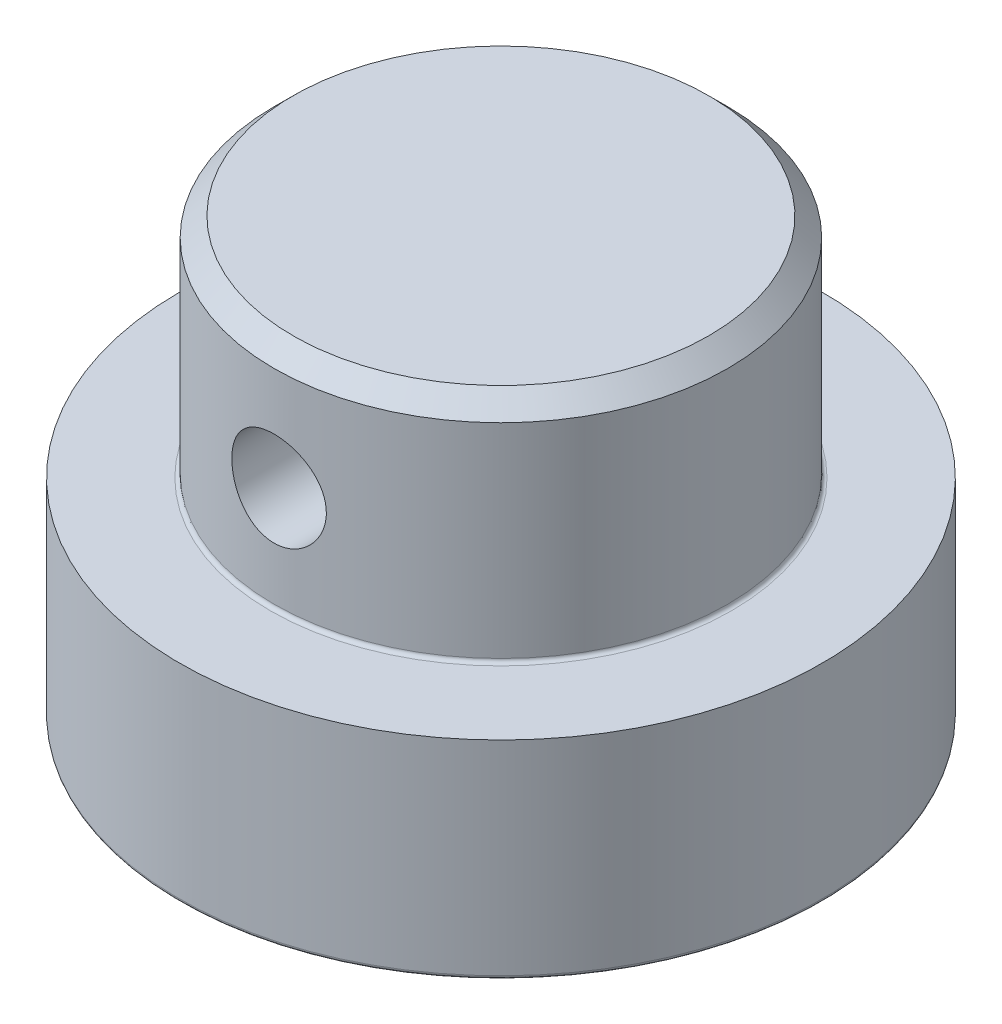
ISO-10303-21;
HEADER;
FILE_DESCRIPTION(('STEP AP214'),'2;1');
FILE_NAME('part.step','',(''),(''),'','','');
FILE_SCHEMA(('AUTOMOTIVE_DESIGN { 1 0 10303 214 1 1 1 1 }'));
ENDSEC;
DATA;
#1=APPLICATION_CONTEXT('core data for automotive mechanical design processes');
#2=APPLICATION_PROTOCOL_DEFINITION('international standard','automotive_design',2000,#1);
#3=PRODUCT_CONTEXT('',#1,'mechanical');
#4=PRODUCT('Part','Part','',(#3));
#5=PRODUCT_RELATED_PRODUCT_CATEGORY('part','',(#4));
#6=PRODUCT_DEFINITION_FORMATION('','',#4);
#7=PRODUCT_DEFINITION_CONTEXT('part definition',#1,'design');
#8=PRODUCT_DEFINITION('design','',#6,#7);
#9=PRODUCT_DEFINITION_SHAPE('','',#8);
#10=(LENGTH_UNIT() NAMED_UNIT(*) SI_UNIT(.MILLI.,.METRE.));
#11=(NAMED_UNIT(*) PLANE_ANGLE_UNIT() SI_UNIT($,.RADIAN.));
#12=(NAMED_UNIT(*) SI_UNIT($,.STERADIAN.) SOLID_ANGLE_UNIT());
#13=UNCERTAINTY_MEASURE_WITH_UNIT(LENGTH_MEASURE(1.E-05),#10,'distance_accuracy_value','');
#14=(GEOMETRIC_REPRESENTATION_CONTEXT(3) GLOBAL_UNCERTAINTY_ASSIGNED_CONTEXT((#13)) GLOBAL_UNIT_ASSIGNED_CONTEXT((#10,
#11,#12)) REPRESENTATION_CONTEXT('',''));
#15=CARTESIAN_POINT('',(0.,0.,0.));
#16=DIRECTION('',(0.,0.,1.));
#17=DIRECTION('',(1.,0.,0.));
#18=AXIS2_PLACEMENT_3D('',#15,#16,#17);
#19=CARTESIAN_POINT('',(0.,26.8000000000001,0.));
#20=DIRECTION('',(0.,-1.,0.));
#21=DIRECTION('',(1.,0.,0.));
#22=AXIS2_PLACEMENT_3D('',#19,#20,#21);
#23=CYLINDRICAL_SURFACE('',#22,17.);
#24=CARTESIAN_POINT('',(0.,4.,0.));
#25=DIRECTION('',(0.,1.,0.));
#26=DIRECTION('',(-1.,0.,0.));
#27=AXIS2_PLACEMENT_3D('',#24,#25,#26);
#28=CIRCLE('',#27,17.);
#29=CARTESIAN_POINT('',(-17.,4.00000000000001,0.));
#30=VERTEX_POINT('',#29);
#31=EDGE_CURVE('E181',#30,#30,#28,.T.);
#32=ORIENTED_EDGE('',*,*,#31,.T.);
#33=EDGE_LOOP('',(#32));
#34=FACE_BOUND('',#33,.T.);
#35=CARTESIAN_POINT('',(0.,14.8,0.));
#36=DIRECTION('',(0.,1.,0.));
#37=DIRECTION('',(-1.,0.,0.));
#38=AXIS2_PLACEMENT_3D('',#35,#36,#37);
#39=CIRCLE('',#38,17.);
#40=CARTESIAN_POINT('',(-17.,14.8,0.));
#41=VERTEX_POINT('',#40);
#42=EDGE_CURVE('E76',#41,#41,#39,.F.);
#43=ORIENTED_EDGE('',*,*,#42,.T.);
#44=EDGE_LOOP('',(#43));
#45=FACE_BOUND('',#44,.T.);
#46=ADVANCED_FACE('F42',(#34,#45),#23,.T.);
#47=CARTESIAN_POINT('',(-0.33169588516096,3.8,-16.0000003060383));
#48=DIRECTION('',(0.,1.,0.));
#49=DIRECTION('',(0.999999999999574,0.,9.22647382873078E-07));
#50=AXIS2_PLACEMENT_3D('',#47,#48,#49);
#51=PLANE('',#50);
#52=CARTESIAN_POINT('',(0.,3.8,0.));
#53=DIRECTION('',(0.,1.,0.));
#54=DIRECTION('',(-1.,0.,0.));
#55=AXIS2_PLACEMENT_3D('',#52,#53,#54);
#56=CIRCLE('',#55,16.8);
#57=CARTESIAN_POINT('',(-16.8,3.80000000000001,0.));
#58=VERTEX_POINT('',#57);
#59=EDGE_CURVE('E179',#58,#58,#56,.F.);
#60=ORIENTED_EDGE('',*,*,#59,.T.);
#61=EDGE_LOOP('',(#60));
#62=FACE_BOUND('',#61,.T.);
#63=CARTESIAN_POINT('',(0.,3.8,-16.));
#64=CARTESIAN_POINT('',(0.262081698930275,3.8,-16.0000219656954));
#65=CARTESIAN_POINT('',(0.524166986858062,3.8,-15.9936210376009));
#66=CARTESIAN_POINT('',(1.04709642529541,3.8,-15.9679794098892));
#67=CARTESIAN_POINT('',(1.3079420447878,3.8,-15.9487686410048));
#68=CARTESIAN_POINT('',(1.82839273207649,3.8,-15.8975113855836));
#69=CARTESIAN_POINT('',(2.08799769062053,3.8,-15.8654637889727));
#70=CARTESIAN_POINT('',(2.60596857412472,3.8,-15.7885750383015));
#71=CARTESIAN_POINT('',(2.86432976380816,3.8,-15.7437020251942));
#72=CARTESIAN_POINT('',(3.3784612174176,3.8,-15.641446702064));
#73=CARTESIAN_POINT('',(3.63423244366,3.8,-15.58406923106));
#74=CARTESIAN_POINT('',(4.14207120624161,3.8,-15.4569325526496));
#75=CARTESIAN_POINT('',(4.39414576459982,3.8,-15.3872014132676));
#76=CARTESIAN_POINT('',(4.89459596455878,3.8,-15.2353904842654));
#77=CARTESIAN_POINT('',(5.14297095882781,3.8,-15.1533085608232));
#78=CARTESIAN_POINT('',(5.63603116630493,3.8,-14.9768299826641));
#79=CARTESIAN_POINT('',(5.88070514271802,3.8,-14.8824019496345));
#80=CARTESIAN_POINT('',(6.36503964918413,3.8,-14.6817948827542));
#81=CARTESIAN_POINT('',(6.60470270207549,3.8,-14.5756219401651));
#82=CARTESIAN_POINT('',(7.07798048722612,3.8,-14.351854114683));
#83=CARTESIAN_POINT('',(7.31160758291379,3.8,-14.2342853920668));
#84=CARTESIAN_POINT('',(7.77282489276656,3.8,-13.9877583737566));
#85=CARTESIAN_POINT('',(8.00041405576125,3.79999999999999,-13.8587981115605));
#86=CARTESIAN_POINT('',(8.44957099685593,3.79999999999999,-13.5895192728353));
#87=CARTESIAN_POINT('',(8.67112163242334,3.79999999999999,-13.4491721129849));
#88=CARTESIAN_POINT('',(9.1070132872293,3.79999999999999,-13.1579306723875));
#89=CARTESIAN_POINT('',(9.32135796917433,3.79999999999999,-13.0070418736721));
#90=CARTESIAN_POINT('',(9.74188691797196,3.79999999999999,-12.6952417706868));
#91=CARTESIAN_POINT('',(9.94808841431275,3.79999999999999,-12.5343537120537));
#92=CARTESIAN_POINT('',(10.3523485273059,3.79999999999999,-12.2025846072434));
#93=CARTESIAN_POINT('',(10.5504057293404,3.79999999999999,-12.0317018374232));
#94=CARTESIAN_POINT('',(10.9383985504476,3.79999999999999,-11.6799709439476));
#95=CARTESIAN_POINT('',(11.1283117800472,3.79999999999999,-11.4990981305329));
#96=CARTESIAN_POINT('',(11.4990095124848,3.79999999999999,-11.1284145692154));
#97=CARTESIAN_POINT('',(11.6797986771428,3.79999999999999,-10.9386084834499));
#98=CARTESIAN_POINT('',(12.0314180976127,3.79999999999999,-10.5507584039877));
#99=CARTESIAN_POINT('',(12.2022697868517,3.79999999999999,-10.3527338479632));
#100=CARTESIAN_POINT('',(12.5340372136361,3.79999999999999,-9.94847235784781));
#101=CARTESIAN_POINT('',(12.694951227479,3.79999999999999,-9.74223400921162));
#102=CARTESIAN_POINT('',(13.0068695820541,3.79999999999999,-9.3215678818168));
#103=CARTESIAN_POINT('',(13.1578471467875,3.79999999999999,-9.10712025567519));
#104=CARTESIAN_POINT('',(13.449105250899,3.79999999999999,-8.67123973505484));
#105=CARTESIAN_POINT('',(13.5893912720593,3.79999999999999,-8.44981050365584));
#106=CARTESIAN_POINT('',(13.8585886270638,3.79999999999999,-8.00081530875065));
#107=CARTESIAN_POINT('',(13.9875247745996,3.79999999999999,-7.77326422797295));
#108=CARTESIAN_POINT('',(14.2340498790216,3.79999999999999,-7.31204589490808));
#109=CARTESIAN_POINT('',(14.3516368693618,3.79999999999999,-7.07837759153327));
#110=CARTESIAN_POINT('',(14.575493909962,3.79999999999999,-6.60494219358234));
#111=CARTESIAN_POINT('',(14.6817338266841,3.79999999999999,-6.36516085672336));
#112=CARTESIAN_POINT('',(14.8823594168663,3.79999999999999,-5.88083402076222));
#113=CARTESIAN_POINT('',(14.9767511814092,3.79999999999999,-5.63629104491208));
#114=CARTESIAN_POINT('',(15.1531813675632,3.79999999999999,-5.14340536810295));
#115=CARTESIAN_POINT('',(15.2352470295541,3.79999999999999,-4.89507242299392));
#116=CARTESIAN_POINT('',(15.3870559901037,3.79999999999999,-4.39462160886503));
#117=CARTESIAN_POINT('',(15.456797154846,3.79999999999999,-4.14250309260801));
#118=CARTESIAN_POINT('',(15.5839901809413,3.79999999999999,-3.63449228094024));
#119=CARTESIAN_POINT('',(15.6414097092325,3.79999999999999,-3.37859189566973));
#120=CARTESIAN_POINT('',(15.7436928565669,3.79999999999999,-2.86443115306237));
#121=CARTESIAN_POINT('',(15.7885629419166,3.79999999999999,-2.60617208218264));
#122=CARTESIAN_POINT('',(15.8654458461095,3.79999999999999,-2.08833724361708));
#123=CARTESIAN_POINT('',(15.8974872851882,3.79999999999999,-1.82876572999084));
#124=CARTESIAN_POINT('',(15.948746168647,3.79999999999999,-1.30831447892884));
#125=CARTESIAN_POINT('',(15.9679613939415,3.79999999999999,-1.04743452297937));
#126=CARTESIAN_POINT('',(15.9936024488697,3.79999999999999,-0.524370868190191));
#127=CARTESIAN_POINT('',(15.9999949884587,3.79999999999999,-0.262185542802591));
#128=CARTESIAN_POINT('',(16.0000050089542,3.79999999999999,0.262050197463097));
#129=CARTESIAN_POINT('',(15.993629082894,3.79999999999999,0.524100612116775));
#130=CARTESIAN_POINT('',(15.968010138234,3.79999999999999,1.04698451000435));
#131=CARTESIAN_POINT('',(15.9487960198658,3.79999999999999,1.30781940445017));
#132=CARTESIAN_POINT('',(15.8975349760888,3.79999999999999,1.8282704427394));
#133=CARTESIAN_POINT('',(15.8654858316037,3.79999999999999,2.08788636797574));
#134=CARTESIAN_POINT('',(15.7885895440035,3.79999999999999,2.60590182296368));
#135=CARTESIAN_POINT('',(15.743709433179,3.79999999999999,2.86429645344402));
#136=CARTESIAN_POINT('',(15.6414459417519,3.79999999999999,3.37846110585533));
#137=CARTESIAN_POINT('',(15.5840690275429,3.79999999999999,3.63423241380316));
#138=CARTESIAN_POINT('',(15.4569327557038,3.79999999999999,4.14207123604796));
#139=CARTESIAN_POINT('',(15.3872014676816,3.79999999999999,4.39414577259632));
#140=CARTESIAN_POINT('',(15.2353904298335,3.79999999999999,4.89459595658362));
#141=CARTESIAN_POINT('',(15.1533085462184,3.79999999999999,5.14297095669566));
#142=CARTESIAN_POINT('',(14.9768299973007,3.79999999999999,5.63603116845918));
#143=CARTESIAN_POINT('',(14.8824019535545,3.79999999999999,5.8807051432965));
#144=CARTESIAN_POINT('',(14.6817948788345,3.79999999999999,6.36503964860995));
#145=CARTESIAN_POINT('',(14.575621939115,3.79999999999999,6.60470270192332));
#146=CARTESIAN_POINT('',(14.351854115728,3.79999999999999,7.07798048738263));
#147=CARTESIAN_POINT('',(14.2342853923455,3.79999999999999,7.31160758295817));
#148=CARTESIAN_POINT('',(13.9877583734742,3.79999999999999,7.77282489272861));
#149=CARTESIAN_POINT('',(13.8587981114835,3.79999999999999,8.00041405575315));
#150=CARTESIAN_POINT('',(13.5895192729097,3.79999999999999,8.44957099686876));
#151=CARTESIAN_POINT('',(13.4491721130046,3.79999999999999,8.67112163242717));
#152=CARTESIAN_POINT('',(13.1579306723671,3.79999999999999,9.10701328722658));
#153=CARTESIAN_POINT('',(13.0070418736662,3.79999999999999,9.32135796917401));
#154=CARTESIAN_POINT('',(12.6952417706913,3.79999999999999,9.74188691797353));
#155=CARTESIAN_POINT('',(12.5343537120543,3.79999999999999,9.94808841431383));
#156=CARTESIAN_POINT('',(12.2025846072411,3.79999999999999,10.3523485273066));
#157=CARTESIAN_POINT('',(12.0317018374221,3.79999999999999,10.5504057293411));
#158=CARTESIAN_POINT('',(11.6799709439475,3.79999999999999,10.9383985504482));
#159=CARTESIAN_POINT('',(11.4990981305328,3.8,11.1283117800475));
#160=CARTESIAN_POINT('',(11.1284145692159,3.8,11.4990095124842));
#161=CARTESIAN_POINT('',(10.9386084834511,3.8,11.6797986771415));
#162=CARTESIAN_POINT('',(10.5507584039898,3.8,12.0314180976105));
#163=CARTESIAN_POINT('',(10.3527338479655,3.8,12.2022697868494));
#164=CARTESIAN_POINT('',(9.9484723578501,3.8,12.5340372136338));
#165=CARTESIAN_POINT('',(9.74223400921369,3.8,12.6949512274768));
#166=CARTESIAN_POINT('',(9.32156788181806,3.8,13.0068695820528));
#167=CARTESIAN_POINT('',(9.10712025567585,3.8,13.1578471467869));
#168=CARTESIAN_POINT('',(8.67123973505736,3.8,13.4491052508975));
#169=CARTESIAN_POINT('',(8.44981050366093,3.8,13.5893912720563));
#170=CARTESIAN_POINT('',(8.00081530875917,3.8,13.8585886270589));
#171=CARTESIAN_POINT('',(7.77326422798228,3.8,13.9875247745941));
#172=CARTESIAN_POINT('',(7.31204589491741,3.8,14.2340498790161));
#173=CARTESIAN_POINT('',(7.07837759154173,3.8,14.3516368693567));
#174=CARTESIAN_POINT('',(6.60494219358741,3.8,14.5754939099589));
#175=CARTESIAN_POINT('',(6.36516085672589,3.8,14.6817338266825));
#176=CARTESIAN_POINT('',(5.88083402075841,3.8,14.8823594168684));
#177=CARTESIAN_POINT('',(5.63629104490445,3.8,14.9767511814134));
#178=CARTESIAN_POINT('',(5.14340536809018,3.8,15.1531813675702));
#179=CARTESIAN_POINT('',(4.89507242297987,3.8,15.2352470295618));
#180=CARTESIAN_POINT('',(4.39462160885098,3.8,15.3870559901115));
#181=CARTESIAN_POINT('',(4.14250309259527,3.8,15.4567971548532));
#182=CARTESIAN_POINT('',(3.63449228093257,3.8,15.5839901809456));
#183=CARTESIAN_POINT('',(3.37859189566585,3.8,15.6414097092345));
#184=CARTESIAN_POINT('',(2.86443115305599,3.8,15.7436928565669));
#185=CARTESIAN_POINT('',(2.60617208216987,3.8,15.7885629419164));
#186=CARTESIAN_POINT('',(2.08833724359582,3.8,15.8654458461091));
#187=CARTESIAN_POINT('',(1.82876572996749,3.8,15.897487285188));
#188=CARTESIAN_POINT('',(1.30831447890552,3.8,15.9487461686468));
#189=CARTESIAN_POINT('',(1.04743452295817,3.8,15.9679613939415));
#190=CARTESIAN_POINT('',(0.524370868177472,3.8,15.9936024488695));
#191=CARTESIAN_POINT('',(0.262185542796234,3.8,15.9999949884586));
#192=CARTESIAN_POINT('',(-0.262050197462777,3.8,16.0000050089543));
#193=CARTESIAN_POINT('',(-0.524100612116139,3.8,15.9936290828941));
#194=CARTESIAN_POINT('',(-1.04698451000329,3.8,15.968010138234));
#195=CARTESIAN_POINT('',(-1.307819404449,3.8,15.9487960198658));
#196=CARTESIAN_POINT('',(-1.82827044273824,3.8,15.8975349760888));
#197=CARTESIAN_POINT('',(-2.08788636797468,3.8,15.8654858316037));
#198=CARTESIAN_POINT('',(-2.60590182296305,3.8,15.7885895440035));
#199=CARTESIAN_POINT('',(-2.86429645344372,3.8,15.7437094331791));
#200=CARTESIAN_POINT('',(-3.37846110585209,3.80000000000001,15.6414459417526));
#201=CARTESIAN_POINT('',(-3.63423241379668,3.80000000000001,15.5840690275443));
#202=CARTESIAN_POINT('',(-4.14207123603719,3.80000000000001,15.4569327557061));
#203=CARTESIAN_POINT('',(-4.39414577258446,3.80000000000001,15.3872014676841));
#204=CARTESIAN_POINT('',(-4.89459595657173,3.80000000000001,15.235390429836));
#205=CARTESIAN_POINT('',(-5.14297095668481,3.80000000000001,15.1533085462205));
#206=CARTESIAN_POINT('',(-5.63603116845268,3.80000000000001,14.9768299973021));
#207=CARTESIAN_POINT('',(-5.88070514329328,3.80000000000001,14.8824019535553));
#208=CARTESIAN_POINT('',(-6.36503964860575,3.80000000000001,14.6817948788368));
#209=CARTESIAN_POINT('',(-6.60470270191502,3.80000000000001,14.5756219391197));
#210=CARTESIAN_POINT('',(-7.07798048736886,3.80000000000001,14.351854115736));
#211=CARTESIAN_POINT('',(-7.31160758294298,3.80000000000001,14.2342853923542));
#212=CARTESIAN_POINT('',(-7.77282489271339,3.80000000000001,13.9877583734828));
#213=CARTESIAN_POINT('',(-8.00041405573924,3.80000000000001,13.8587981114913));
#214=CARTESIAN_POINT('',(-8.44957099686047,3.80000000000001,13.5895192729145));
#215=CARTESIAN_POINT('',(-8.67112163242309,3.80000000000001,13.4491721130071));
#216=CARTESIAN_POINT('',(-9.10701328722236,3.80000000000001,13.1579306723702));
#217=CARTESIAN_POINT('',(-9.32135796916572,3.80000000000001,13.0070418736726));
#218=CARTESIAN_POINT('',(-9.74188691795982,3.80000000000001,12.695241770702));
#219=CARTESIAN_POINT('',(-9.94808841429867,3.80000000000001,12.5343537120659));
#220=CARTESIAN_POINT('',(-10.3523485272914,3.80000000000001,12.2025846072527));
#221=CARTESIAN_POINT('',(-10.5504057293272,3.80000000000001,12.0317018374325));
#222=CARTESIAN_POINT('',(-10.9383985504399,3.80000000000001,11.6799709439539));
#223=CARTESIAN_POINT('',(-11.1283117800434,3.80000000000001,11.499098130536));
#224=CARTESIAN_POINT('',(-11.4990095124819,3.80000000000001,11.1284145692191));
#225=CARTESIAN_POINT('',(-11.6797986771371,3.80000000000001,10.9386084834576));
#226=CARTESIAN_POINT('',(-12.0314180976033,3.80000000000001,10.5507584040006));
#227=CARTESIAN_POINT('',(-12.2022697868413,3.80000000000001,10.3527338479772));
#228=CARTESIAN_POINT('',(-12.5340372136257,3.80000000000001,9.94847235786181));
#229=CARTESIAN_POINT('',(-12.6949512274694,3.80000000000001,9.7422340092243));
#230=CARTESIAN_POINT('',(-13.0068695820484,3.80000000000001,9.32156788182446));
#231=CARTESIAN_POINT('',(-13.1578471467847,3.80000000000001,9.10712025567906));
#232=CARTESIAN_POINT('',(-13.4491052508983,3.80000000000001,8.67123973505625));
#233=CARTESIAN_POINT('',(-13.589391272058,3.80000000000001,8.44981050365877));
#234=CARTESIAN_POINT('',(-13.8585886270617,3.80000000000001,8.00081530875557));
#235=CARTESIAN_POINT('',(-13.9875247745972,3.80000000000001,7.77326422797833));
#236=CARTESIAN_POINT('',(-14.2340498790192,3.80000000000001,7.31204589491345));
#237=CARTESIAN_POINT('',(-14.3516368693596,3.80000000000001,7.07837759153815));
#238=CARTESIAN_POINT('',(-14.5754939099607,3.80000000000001,6.60494219358527));
#239=CARTESIAN_POINT('',(-14.6817338266835,3.80000000000001,6.36516085672484));
#240=CARTESIAN_POINT('',(-14.8823594168663,3.80000000000001,5.88083402076218));
#241=CARTESIAN_POINT('',(-14.9767511814093,3.80000000000001,5.63629104491201));
#242=CARTESIAN_POINT('',(-15.1531813675635,3.80000000000001,5.14340536810282));
#243=CARTESIAN_POINT('',(-15.2352470295544,3.80000000000001,4.89507242299378));
#244=CARTESIAN_POINT('',(-15.387055990104,3.80000000000001,4.39462160886488));
#245=CARTESIAN_POINT('',(-15.4567971548462,3.80000000000001,4.14250309260788));
#246=CARTESIAN_POINT('',(-15.5839901809415,3.80000000000001,3.63449228094016));
#247=CARTESIAN_POINT('',(-15.6414097092325,3.80000000000001,3.37859189566968));
#248=CARTESIAN_POINT('',(-15.7436928565676,3.80000000000001,2.86443115305889));
#249=CARTESIAN_POINT('',(-15.7885629419179,3.80000000000001,2.60617208217566));
#250=CARTESIAN_POINT('',(-15.8654458461116,3.80000000000001,2.08833724360544));
#251=CARTESIAN_POINT('',(-15.8974872851906,3.80000000000001,1.82876572997804));
#252=CARTESIAN_POINT('',(-15.9487461686494,3.80000000000001,1.30831447891603));
#253=CARTESIAN_POINT('',(-15.9679613939438,3.80000000000001,1.04743452296773));
#254=CARTESIAN_POINT('',(-15.993602448871,3.80000000000001,0.524370868183196));
#255=CARTESIAN_POINT('',(-15.9999949884594,3.80000000000001,0.262185542799084));
#256=CARTESIAN_POINT('',(-16.0000050089536,3.80000000000001,-0.262050197464064));
#257=CARTESIAN_POINT('',(-15.9936290828926,3.80000000000001,-0.52410061211869));
#258=CARTESIAN_POINT('',(-15.9680101382317,3.80000000000001,-1.04698451000753));
#259=CARTESIAN_POINT('',(-15.9487960198633,3.80000000000001,-1.30781940445366));
#260=CARTESIAN_POINT('',(-15.8975349760863,3.80000000000001,-1.82827044274288));
#261=CARTESIAN_POINT('',(-15.8654858316014,3.80000000000001,-2.0878863679789));
#262=CARTESIAN_POINT('',(-15.7885895440021,3.80000000000001,-2.60590182296557));
#263=CARTESIAN_POINT('',(-15.7437094331783,3.80000000000001,-2.86429645344496));
#264=CARTESIAN_POINT('',(-15.6414459417528,3.80000000000001,-3.37846110585328));
#265=CARTESIAN_POINT('',(-15.5840690275447,3.80000000000001,-3.63423241379906));
#266=CARTESIAN_POINT('',(-15.4569327557067,3.80000000000001,-4.14207123604115));
#267=CARTESIAN_POINT('',(-15.3872014676848,3.80000000000001,-4.39414577258882));
#268=CARTESIAN_POINT('',(-15.2353904298367,3.80000000000001,-4.89459595657611));
#269=CARTESIAN_POINT('',(-15.1533085462212,3.80000000000001,-5.14297095668882));
#270=CARTESIAN_POINT('',(-14.9768299973025,3.80000000000001,-5.6360311684551));
#271=CARTESIAN_POINT('',(-14.8824019535554,3.80000000000001,-5.88070514329447));
#272=CARTESIAN_POINT('',(-14.6817948788348,3.80000000000001,-6.36503964860909));
#273=CARTESIAN_POINT('',(-14.5756219391157,3.80000000000001,-6.60470270192164));
#274=CARTESIAN_POINT('',(-14.3518541157291,3.80000000000001,-7.07798048737986));
#275=CARTESIAN_POINT('',(-14.2342853923467,3.80000000000001,-7.31160758295512));
#276=CARTESIAN_POINT('',(-13.9877583734754,3.80000000000001,-7.77282489272555));
#277=CARTESIAN_POINT('',(-13.8587981114846,3.80000000000001,-8.00041405575034));
#278=CARTESIAN_POINT('',(-13.5895192729104,3.80000000000001,-8.44957099686709));
#279=CARTESIAN_POINT('',(-13.449172113005,3.80000000000001,-8.67112163242636));
#280=CARTESIAN_POINT('',(-13.1579306723687,3.80000000000001,-9.10701328722449));
#281=CARTESIAN_POINT('',(-13.0070418736694,3.80000000000001,-9.32135796916987));
#282=CARTESIAN_POINT('',(-12.6952417706967,3.80000000000001,-9.74188691796667));
#283=CARTESIAN_POINT('',(-12.5343537120601,3.80000000000001,-9.94808841430624));
#284=CARTESIAN_POINT('',(-12.2025846072469,3.80000000000001,-10.352348527299));
#285=CARTESIAN_POINT('',(-12.0317018374273,3.80000000000001,-10.5504057293342));
#286=CARTESIAN_POINT('',(-11.6799709439507,3.80000000000001,-10.938398550444));
#287=CARTESIAN_POINT('',(-11.4990981305344,3.80000000000001,-11.1283117800453));
#288=CARTESIAN_POINT('',(-11.128414569216,3.80000000000001,-11.4990095124847));
#289=CARTESIAN_POINT('',(-10.9386084834514,3.80000000000001,-11.6797986771426));
#290=CARTESIAN_POINT('',(-10.5507584039901,3.80000000000001,-12.0314180976117));
#291=CARTESIAN_POINT('',(-10.3527338479656,3.80000000000001,-12.2022697868499));
#292=CARTESIAN_POINT('',(-9.94847235785072,3.80000000000001,-12.5340372136363));
#293=CARTESIAN_POINT('',(-9.74223400921499,3.80000000000001,-12.694951227482));
#294=CARTESIAN_POINT('',(-9.32156788181731,3.80000000000001,-13.0068695820499));
#295=CARTESIAN_POINT('',(-9.10712025567236,3.80000000000001,-13.1578471467732));
#296=CARTESIAN_POINT('',(-8.67123973505806,3.80000000000001,-13.4491052509131));
#297=CARTESIAN_POINT('',(-8.44981050366846,3.80000000000001,-13.5893912721121));
#298=CARTESIAN_POINT('',(-8.00081530873634,3.8,-13.858588627011));
#299=CARTESIAN_POINT('',(-7.77326422792242,3.8,-13.987524774403));
#300=CARTESIAN_POINT('',(-7.31204589495628,3.8,-14.234049879218));
#301=CARTESIAN_POINT('',(-7.07837759171646,3.8,-14.3516368700949));
#302=CARTESIAN_POINT('',(-6.60494219339699,3.8,-14.5754939092267));
#303=CARTESIAN_POINT('',(-6.36516085603285,3.8,-14.6817338239371));
#304=CARTESIAN_POINT('',(-5.88083402145266,3.8,-14.8823594196118));
#305=CARTESIAN_POINT('',(-5.6362910474874,3.8,-14.9767511916542));
#306=CARTESIAN_POINT('',(-5.1434053655365,3.8,-15.1531813573408));
#307=CARTESIAN_POINT('',(-4.8950724134208,3.8,-15.2352469914442));
#308=CARTESIAN_POINT('',(-4.39462161844404,3.8,-15.3870560282197));
#309=CARTESIAN_POINT('',(-4.14250312835155,3.8,-15.456797297098));
#310=CARTESIAN_POINT('',(-3.63449224510711,3.8,-15.5839900383201));
#311=CARTESIAN_POINT('',(-3.37859176177396,3.8,-15.6414091763227));
#312=CARTESIAN_POINT('',(-2.8643978536374,3.8,-15.743700040226));
#313=CARTESIAN_POINT('',(-2.60610539116446,3.8,-15.7885766034157));
#314=CARTESIAN_POINT('',(-2.08822580202617,3.8,-15.8654687566495));
#315=CARTESIAN_POINT('',(-1.8286430943897,3.8,-15.8975140702313));
#316=CARTESIAN_POINT('',(-1.30819210350458,3.8,-15.9487703888383));
#317=CARTESIAN_POINT('',(-1.0473237110393,3.8,-15.967980283905));
#318=CARTESIAN_POINT('',(-0.524303328030982,3.8,-15.9936223869105));
#319=CARTESIAN_POINT('',(-0.262149759093317,3.8,-16.0000224325274));
#320=CARTESIAN_POINT('',(0.,3.8,-16.));
#321=B_SPLINE_CURVE_WITH_KNOTS('',3,(#63,#64,#65,#66,#67,#68,#69,#70,#71,#72,#73,#74,#75,#76,
#77,#78,#79,#80,#81,#82,#83,#84,#85,#86,#87,#88,#89,#90,#91,#92,#93,#94,#95,#96,#97,#98,#99,
#100,#101,#102,#103,#104,#105,#106,#107,#108,#109,#110,#111,#112,#113,#114,#115,#116,#117,#118,
#119,#120,#121,#122,#123,#124,#125,#126,#127,#128,#129,#130,#131,#132,#133,#134,#135,#136,#137,
#138,#139,#140,#141,#142,#143,#144,#145,#146,#147,#148,#149,#150,#151,#152,#153,#154,#155,#156,
#157,#158,#159,#160,#161,#162,#163,#164,#165,#166,#167,#168,#169,#170,#171,#172,#173,#174,#175,
#176,#177,#178,#179,#180,#181,#182,#183,#184,#185,#186,#187,#188,#189,#190,#191,#192,#193,#194,
#195,#196,#197,#198,#199,#200,#201,#202,#203,#204,#205,#206,#207,#208,#209,#210,#211,#212,#213,
#214,#215,#216,#217,#218,#219,#220,#221,#222,#223,#224,#225,#226,#227,#228,#229,#230,#231,#232,
#233,#234,#235,#236,#237,#238,#239,#240,#241,#242,#243,#244,#245,#246,#247,#248,#249,#250,#251,
#252,#253,#254,#255,#256,#257,#258,#259,#260,#261,#262,#263,#264,#265,#266,#267,#268,#269,#270,
#271,#272,#273,#274,#275,#276,#277,#278,#279,#280,#281,#282,#283,#284,#285,#286,#287,#288,#289,
#290,#291,#292,#293,#294,#295,#296,#297,#298,#299,#300,#301,#302,#303,#304,#305,#306,#307,#308,
#309,#310,#311,#312,#313,#314,#315,#316,#317,#318,#319,#320),.UNSPECIFIED.,.F.,.F.,(4,2,2,2,2,2,
2,2,2,2,2,2,2,2,2,2,2,2,2,2,2,2,2,2,2,2,2,2,2,2,2,2,2,2,2,2,2,2,2,2,2,2,2,2,2,2,2,2,2,2,2,2,2,2,
2,2,2,2,2,2,2,2,2,2,2,2,2,2,2,2,2,2,2,2,2,2,2,2,2,2,2,2,2,2,2,2,2,2,2,2,2,2,2,2,2,2,2,2,2,2,2,2,
2,2,2,2,2,2,2,2,2,2,2,2,2,2,2,2,2,2,2,2,2,2,2,2,2,2,4),(0.,0.786171304559991,1.57051209357503,
2.35492072369289,3.14129506024353,3.92736562156307,4.71167258374695,5.49611520509572,
6.28259176110264,7.06866232242144,7.85296928460505,8.6374119059541,9.4238884619619,
10.2099590232848,10.9942659854698,11.7787086068174,12.5651851628211,13.351255724138,
14.135562686321,14.9200053076707,15.7064818636802,16.492552424995,17.2768593871773,
18.0613020085277,18.8477785645394,19.6338491258555,20.4181560880382,21.2025987093881,
21.9890752653986,22.7751458267134,23.5594527888957,24.3438954102461,25.1303719662578,
25.916442527586,26.7007494897728,27.4851921111187,28.2716686671172,29.0577392284466,
29.8420461906338,30.6264888119792,31.4129653679762,32.199035929298,32.9833428914827,
33.7677855128307,34.5542620688355,35.3403326301594,36.1246395923447,36.909082213692,
37.6955587696947,38.4816293310089,39.265936293191,40.0503789145415,40.8368554705537,
41.6229260318597,42.407232994039,43.1916756153924,43.9781521714129,44.7642227327419,
45.5485296949289,46.3329723162746,47.1194488722725,47.9055194336061,48.6898263957947,
49.4742690171387,50.2607455731314,51.0468161344586,51.8311230966451,52.6155657179913,
53.4020422739908,54.1881128353102,54.9724197974941,55.7568624188428,56.5433389748497,
57.3294095361572,58.1137164983371,58.8981591196899,59.6846356757089,60.4707062370172,
61.2550131991973,62.0394558205499,62.8259323765681,63.6120029378708,64.396309900049,
65.1807525214034,65.9672290774272,66.7532996387373,67.537606600918,68.32204922227,
69.1085257782865,69.8945963396028,70.6789033017856,71.4633459231354,72.2498224791457,
73.0358930404712,73.820200002657,74.6046426240039,75.3911191800051,76.1771897413362,
76.9614967035239,77.7459393248689,78.5324158808642,79.318486442187,80.102793404372,
80.8872360257197,81.6737125817234,82.4597831430425,83.2440901052262,84.0285327265751,
84.8150092825825,85.6010798438986,86.3853868060813,87.1698294274313,87.9563059834417,
88.7423765447566,89.5266835069389,90.3111261282892,91.0976026843009,91.8836732456165,
92.667980207799,93.4524228291491,94.2388993851601,95.0249699464744,95.8092769086566,
96.5937195300071,97.3801960860193,98.1663689021105,98.9507098671399,99.7351186502357,
100.521494429036),.UNSPECIFIED.);
#322=CARTESIAN_POINT('',(0.,3.8,-16.));
#323=VERTEX_POINT('',#322);
#324=EDGE_CURVE('E53',#323,#323,#321,.T.);
#325=ORIENTED_EDGE('',*,*,#324,.F.);
#326=EDGE_LOOP('',(#325));
#327=FACE_BOUND('',#326,.T.);
#328=ADVANCED_FACE('F77',(#62,#327),#51,.F.);
#329=CARTESIAN_POINT('',(0.,0.8,0.));
#330=DIRECTION('',(0.,-1.,0.));
#331=DIRECTION('',(0.,0.,-1.));
#332=AXIS2_PLACEMENT_3D('',#329,#330,#331);
#333=PLANE('',#332);
#334=CARTESIAN_POINT('',(0.,0.8,0.));
#335=DIRECTION('',(0.,-1.,0.));
#336=DIRECTION('',(0.,0.,-1.));
#337=AXIS2_PLACEMENT_3D('',#334,#335,#336);
#338=CIRCLE('',#337,10.7);
#339=CARTESIAN_POINT('',(0.,0.8,-10.7));
#340=VERTEX_POINT('',#339);
#341=EDGE_CURVE('E74',#340,#340,#338,.T.);
#342=ORIENTED_EDGE('',*,*,#341,.T.);
#343=EDGE_LOOP('',(#342));
#344=FACE_BOUND('',#343,.T.);
#345=ADVANCED_FACE('F87',(#344),#333,.T.);
#346=CARTESIAN_POINT('',(0.,1.8,0.));
#347=DIRECTION('',(0.,-1.,0.));
#348=DIRECTION('',(0.,0.,-1.));
#349=AXIS2_PLACEMENT_3D('',#346,#347,#348);
#350=TOROIDAL_SURFACE('',#349,10.7,1.);
#351=CARTESIAN_POINT('',(0.,1.80000000000001,0.));
#352=DIRECTION('',(0.,-1.,0.));
#353=DIRECTION('',(0.,0.,-1.));
#354=AXIS2_PLACEMENT_3D('',#351,#352,#353);
#355=CIRCLE('',#354,11.7);
#356=CARTESIAN_POINT('',(0.,1.80000000000001,-11.7));
#357=VERTEX_POINT('',#356);
#358=EDGE_CURVE('E138',#357,#357,#355,.T.);
#359=ORIENTED_EDGE('',*,*,#358,.T.);
#360=EDGE_LOOP('',(#359));
#361=FACE_BOUND('',#360,.T.);
#362=ORIENTED_EDGE('',*,*,#341,.F.);
#363=EDGE_LOOP('',(#362));
#364=FACE_BOUND('',#363,.T.);
#365=ADVANCED_FACE('F127',(#361,#364),#350,.T.);
#366=CARTESIAN_POINT('',(0.,0.,0.));
#367=DIRECTION('',(0.,-1.,0.));
#368=DIRECTION('',(0.,0.,-1.));
#369=AXIS2_PLACEMENT_3D('',#366,#367,#368);
#370=CYLINDRICAL_SURFACE('',#369,11.7);
#371=CARTESIAN_POINT('',(0.,1.99999999999999,0.));
#372=DIRECTION('',(0.,-1.,0.));
#373=DIRECTION('',(0.,0.,-1.));
#374=AXIS2_PLACEMENT_3D('',#371,#372,#373);
#375=CIRCLE('',#374,11.7);
#376=CARTESIAN_POINT('',(0.,1.99999999999999,-11.7));
#377=VERTEX_POINT('',#376);
#378=EDGE_CURVE('E68',#377,#377,#375,.T.);
#379=ORIENTED_EDGE('',*,*,#378,.T.);
#380=EDGE_LOOP('',(#379));
#381=FACE_BOUND('',#380,.T.);
#382=ORIENTED_EDGE('',*,*,#358,.F.);
#383=EDGE_LOOP('',(#382));
#384=FACE_BOUND('',#383,.T.);
#385=ADVANCED_FACE('F124',(#381,#384),#370,.T.);
#386=CARTESIAN_POINT('',(0.,2.,0.));
#387=DIRECTION('',(0.,-1.,0.));
#388=DIRECTION('',(0.,0.,-1.));
#389=AXIS2_PLACEMENT_3D('',#386,#387,#388);
#390=TOROIDAL_SURFACE('',#389,13.5,1.8);
#391=CARTESIAN_POINT('',(0.,3.8,0.));
#392=DIRECTION('',(0.,-1.,0.));
#393=DIRECTION('',(0.,0.,-1.));
#394=AXIS2_PLACEMENT_3D('',#391,#392,#393);
#395=CIRCLE('',#394,13.5);
#396=CARTESIAN_POINT('',(0.,3.8,-13.5));
#397=VERTEX_POINT('',#396);
#398=EDGE_CURVE('E59',#397,#397,#395,.T.);
#399=ORIENTED_EDGE('',*,*,#398,.T.);
#400=EDGE_LOOP('',(#399));
#401=FACE_BOUND('',#400,.T.);
#402=ORIENTED_EDGE('',*,*,#378,.F.);
#403=EDGE_LOOP('',(#402));
#404=FACE_BOUND('',#403,.T.);
#405=ADVANCED_FACE('F121',(#401,#404),#390,.F.);
#406=CARTESIAN_POINT('',(13.5,3.8,0.));
#407=DIRECTION('',(0.,-1.,0.));
#408=DIRECTION('',(0.,0.,-1.));
#409=AXIS2_PLACEMENT_3D('',#406,#407,#408);
#410=PLANE('',#409);
#411=ORIENTED_EDGE('',*,*,#324,.T.);
#412=EDGE_LOOP('',(#411));
#413=FACE_BOUND('',#412,.T.);
#414=ORIENTED_EDGE('',*,*,#398,.F.);
#415=EDGE_LOOP('',(#414));
#416=FACE_BOUND('',#415,.T.);
#417=ADVANCED_FACE('F54',(#413,#416),#410,.T.);
#418=CARTESIAN_POINT('',(0.,14.8,0.));
#419=DIRECTION('',(0.,1.,0.));
#420=DIRECTION('',(-1.,0.,0.));
#421=AXIS2_PLACEMENT_3D('',#418,#419,#420);
#422=PLANE('',#421);
#423=CARTESIAN_POINT('',(0.,14.8,0.));
#424=DIRECTION('',(0.,1.,0.));
#425=DIRECTION('',(-1.,0.,0.));
#426=AXIS2_PLACEMENT_3D('',#423,#424,#425);
#427=CIRCLE('',#426,12.2);
#428=CARTESIAN_POINT('',(-12.2,14.8,0.));
#429=VERTEX_POINT('',#428);
#430=EDGE_CURVE('E12',#429,#429,#427,.F.);
#431=ORIENTED_EDGE('',*,*,#430,.T.);
#432=EDGE_LOOP('',(#431));
#433=FACE_BOUND('',#432,.T.);
#434=ORIENTED_EDGE('',*,*,#42,.F.);
#435=EDGE_LOOP('',(#434));
#436=FACE_BOUND('',#435,.T.);
#437=ADVANCED_FACE('F117',(#433,#436),#422,.T.);
#438=CARTESIAN_POINT('',(0.,14.8,0.));
#439=DIRECTION('',(0.,1.,0.));
#440=DIRECTION('',(-1.,0.,0.));
#441=AXIS2_PLACEMENT_3D('',#438,#439,#440);
#442=CYLINDRICAL_SURFACE('',#441,12.);
#443=CARTESIAN_POINT('',(0.,15.,0.));
#444=DIRECTION('',(0.,1.,0.));
#445=DIRECTION('',(-1.,0.,0.));
#446=AXIS2_PLACEMENT_3D('',#443,#444,#445);
#447=CIRCLE('',#446,12.);
#448=CARTESIAN_POINT('',(-12.,15.,0.));
#449=VERTEX_POINT('',#448);
#450=EDGE_CURVE('E49',#449,#449,#447,.T.);
#451=ORIENTED_EDGE('',*,*,#450,.T.);
#452=EDGE_LOOP('',(#451));
#453=FACE_BOUND('',#452,.T.);
#454=CARTESIAN_POINT('',(0.,25.8,0.));
#455=DIRECTION('',(0.,-1.,0.));
#456=DIRECTION('',(1.,0.,0.));
#457=AXIS2_PLACEMENT_3D('',#454,#455,#456);
#458=CIRCLE('',#457,12.);
#459=CARTESIAN_POINT('',(12.,25.8,0.));
#460=VERTEX_POINT('',#459);
#461=EDGE_CURVE('E178',#460,#460,#458,.T.);
#462=ORIENTED_EDGE('',*,*,#461,.T.);
#463=EDGE_LOOP('',(#462));
#464=FACE_BOUND('',#463,.T.);
#465=CARTESIAN_POINT('',(2.5,20.3,-11.7366945943055));
#466=CARTESIAN_POINT('',(2.499995017553,20.1612187696962,-11.7366973843002));
#467=CARTESIAN_POINT('',(2.48840458867923,20.0223760559691,-11.7391829184982));
#468=CARTESIAN_POINT('',(2.44239298467531,19.748627365366,-11.7488403116286));
#469=CARTESIAN_POINT('',(2.40795430880677,19.6137244889873,-11.7560157627658));
#470=CARTESIAN_POINT('',(2.31736795014468,19.3518552543301,-11.7742058592406));
#471=CARTESIAN_POINT('',(2.26124282497867,19.2248808080163,-11.7852165141394));
#472=CARTESIAN_POINT('',(2.12893977203463,18.9821510007088,-11.8098316267143));
#473=CARTESIAN_POINT('',(2.05276265471639,18.86639518654,-11.8234359795523));
#474=CARTESIAN_POINT('',(1.88127279893217,18.6476092496931,-11.8519386932295));
#475=CARTESIAN_POINT('',(1.78571110973934,18.5447762127471,-11.8668522874608));
#476=CARTESIAN_POINT('',(1.57870244776128,18.3564778627038,-11.8961593360515));
#477=CARTESIAN_POINT('',(1.46725431091201,18.2710138234171,-11.9105527521983));
#478=CARTESIAN_POINT('',(1.23032410599918,18.1191082238343,-11.937362702377));
#479=CARTESIAN_POINT('',(1.10471885640989,18.0528549470735,-11.9497591726249));
#480=CARTESIAN_POINT('',(0.843857102013446,17.9424678942804,-11.971006946866));
#481=CARTESIAN_POINT('',(0.708601579901189,17.8983318696929,-11.9798586112245));
#482=CARTESIAN_POINT('',(0.434325808401011,17.8340484777651,-11.9929117978436));
#483=CARTESIAN_POINT('',(0.295386761832722,17.8135679656097,-11.9971778391985));
#484=CARTESIAN_POINT('',(0.0159836976790564,17.796136608486,-12.0008022516123));
#485=CARTESIAN_POINT('',(-0.124480159473669,17.7991833116138,-12.0001611340738));
#486=CARTESIAN_POINT('',(-0.400653172399134,17.8284692019135,-11.9940931618102));
#487=CARTESIAN_POINT('',(-0.536402257452941,17.8543494379162,-11.9887403791317));
#488=CARTESIAN_POINT('',(-0.801587492579494,17.9279972506626,-11.9739344179777));
#489=CARTESIAN_POINT('',(-0.931023375022033,17.9757657544062,-11.9644810658381));
#490=CARTESIAN_POINT('',(-1.18092001076936,18.092160104251,-11.9424153464785));
#491=CARTESIAN_POINT('',(-1.30131426996329,18.1609245884193,-11.9297820825069));
#492=CARTESIAN_POINT('',(-1.52898691302128,18.3172560056808,-11.9027460088038));
#493=CARTESIAN_POINT('',(-1.63626366363282,18.4048252764122,-11.8883429791665));
#494=CARTESIAN_POINT('',(-1.83678840655381,18.5982432497821,-11.8590340046655));
#495=CARTESIAN_POINT('',(-1.92973297498957,18.7044061199639,-11.8441236995185));
#496=CARTESIAN_POINT('',(-2.09655194480974,18.9309640979896,-11.8157374529799));
#497=CARTESIAN_POINT('',(-2.17042592139958,19.0513595227745,-11.8022615435432));
#498=CARTESIAN_POINT('',(-2.29712434276907,19.3034245096576,-11.7782599681831));
#499=CARTESIAN_POINT('',(-2.34989610979453,19.4351213013869,-11.7677417046425));
#500=CARTESIAN_POINT('',(-2.43247155077344,19.7057832387388,-11.7509521282072));
#501=CARTESIAN_POINT('',(-2.46227849764696,19.8447473456162,-11.7446802101436));
#502=CARTESIAN_POINT('',(-2.49761727734033,20.1232394126378,-11.7372156647826));
#503=CARTESIAN_POINT('',(-2.50358885835995,20.2627091690741,-11.7359310372695));
#504=CARTESIAN_POINT('',(-2.49227386878587,20.5406516230803,-11.7383390403741));
#505=CARTESIAN_POINT('',(-2.47498873715723,20.6791243818047,-11.7420313630525));
#506=CARTESIAN_POINT('',(-2.41803116650966,20.9496410321162,-11.7538907645233));
#507=CARTESIAN_POINT('',(-2.37859682753741,21.0817373343576,-11.76201022566));
#508=CARTESIAN_POINT('',(-2.27871621721837,21.3374479788832,-11.7817667700624));
#509=CARTESIAN_POINT('',(-2.21826809112291,21.4610615713008,-11.7934041638211));
#510=CARTESIAN_POINT('',(-2.07709196362967,21.6982128824324,-11.8190900387438));
#511=CARTESIAN_POINT('',(-1.99609065470791,21.8115844089323,-11.8331701329665));
#512=CARTESIAN_POINT('',(-1.81646888113974,22.0232864983101,-11.8620696798782));
#513=CARTESIAN_POINT('',(-1.71784644101033,22.1216153724784,-11.8768892153306));
#514=CARTESIAN_POINT('',(-1.50380090168666,22.3021254261943,-11.9058984863347));
#515=CARTESIAN_POINT('',(-1.38812381522909,22.3840081900527,-11.9200734943982));
#516=CARTESIAN_POINT('',(-1.1444002044327,22.5271775041759,-11.9459341754481));
#517=CARTESIAN_POINT('',(-1.01635422695375,22.5884649644749,-11.9576199584164));
#518=CARTESIAN_POINT('',(-0.752284235695824,22.6882773586347,-11.9771229654136));
#519=CARTESIAN_POINT('',(-0.616313421940377,22.7269383310887,-11.9849632627299));
#520=CARTESIAN_POINT('',(-0.33962680100693,22.7808288080162,-11.9959912282046));
#521=CARTESIAN_POINT('',(-0.198911618923372,22.7960613870654,-11.9991795068579));
#522=CARTESIAN_POINT('',(0.0804266869406841,22.802535244097,-12.0005281611387));
#523=CARTESIAN_POINT('',(0.219039184355833,22.7942237999895,-11.9987822750957));
#524=CARTESIAN_POINT('',(0.492845740747139,22.7548387226941,-11.99065748189));
#525=CARTESIAN_POINT('',(0.6280398504055,22.7237654271863,-11.9842786434588));
#526=CARTESIAN_POINT('',(0.890863930984031,22.639944410703,-11.9676092015489));
#527=CARTESIAN_POINT('',(1.01851310000874,22.5872546722943,-11.9573290681437));
#528=CARTESIAN_POINT('',(1.2632211344418,22.4617552045354,-11.9339599069615));
#529=CARTESIAN_POINT('',(1.3802790765602,22.3889437233116,-11.9208706346327));
#530=CARTESIAN_POINT('',(1.60268064259534,22.2237806640155,-11.8930319356995));
#531=CARTESIAN_POINT('',(1.7077852672274,22.1311114238945,-11.8782576059507));
#532=CARTESIAN_POINT('',(1.90110548396524,21.9295109979979,-11.8488557363333));
#533=CARTESIAN_POINT('',(1.98931704315915,21.8205759400736,-11.8342282323044));
#534=CARTESIAN_POINT('',(2.14734903704122,21.5879817951589,-11.8065838324643));
#535=CARTESIAN_POINT('',(2.21693856248136,21.4641631771794,-11.7935881325424));
#536=CARTESIAN_POINT('',(2.3342125584477,21.2063496879378,-11.7709407916825));
#537=CARTESIAN_POINT('',(2.381916325835,21.0723639031215,-11.7612862067076));
#538=CARTESIAN_POINT('',(2.44513108264677,20.8317874368468,-11.7482800883641));
#539=CARTESIAN_POINT('',(2.46566898011599,20.7265409268095,-11.7439632719021));
#540=CARTESIAN_POINT('',(2.4931050871655,20.5142084389624,-11.7381695052653));
#541=CARTESIAN_POINT('',(2.50000384585404,20.4071225353812,-11.7366924407628));
#542=CARTESIAN_POINT('',(2.5,20.3,-11.7366945943055));
#543=B_SPLINE_CURVE_WITH_KNOTS('',3,(#465,#466,#467,#468,#469,#470,#471,#472,#473,#474,#475,
#476,#477,#478,#479,#480,#481,#482,#483,#484,#485,#486,#487,#488,#489,#490,#491,#492,#493,#494,
#495,#496,#497,#498,#499,#500,#501,#502,#503,#504,#505,#506,#507,#508,#509,#510,#511,#512,#513,
#514,#515,#516,#517,#518,#519,#520,#521,#522,#523,#524,#525,#526,#527,#528,#529,#530,#531,#532,
#533,#534,#535,#536,#537,#538,#539,#540,#541,#542),.UNSPECIFIED.,.T.,.F.,(4,2,2,2,2,2,2,2,2,2,2,
2,2,2,2,2,2,2,2,2,2,2,2,2,2,2,2,2,2,2,2,2,2,2,2,2,2,2,4),(0.,0.415951308142536,0.83222158483494,
1.24806002960546,1.66388166963158,2.08542666935769,2.50700257327747,2.93258052533687,
3.35811520213865,3.77758097718528,4.19700303792676,4.60994682832921,5.0229081091174,
5.43865743955897,5.85445848208518,6.27811724489825,6.70178544383254,7.12650474664974,
7.55116350775192,7.96795032019583,8.38471134593046,8.79707572463843,9.20947650928059,
9.627678358693,10.0459271216437,10.4711891750668,10.8964324351808,11.3190919929707,
11.7416960791916,12.1563258784529,12.5709495266596,12.984468211702,13.3980229105634,
13.8187663795714,14.2396101685507,14.6654530271771,15.0909196914727,15.4119973517483,
15.7330620852561),.UNSPECIFIED.);
#544=CARTESIAN_POINT('',(2.5,20.3,-11.7366945943055));
#545=VERTEX_POINT('',#544);
#546=EDGE_CURVE('E142',#545,#545,#543,.T.);
#547=ORIENTED_EDGE('',*,*,#546,.F.);
#548=EDGE_LOOP('',(#547));
#549=FACE_BOUND('',#548,.T.);
#550=CARTESIAN_POINT('',(2.5,20.3,11.7366945943055));
#551=CARTESIAN_POINT('',(2.499995017553,20.4387812303038,11.7366973843002));
#552=CARTESIAN_POINT('',(2.48840458867923,20.5776239440309,11.7391829184982));
#553=CARTESIAN_POINT('',(2.44239298467531,20.851372634634,11.7488403116286));
#554=CARTESIAN_POINT('',(2.40795430880677,20.9862755110127,11.7560157627658));
#555=CARTESIAN_POINT('',(2.31736795014468,21.2481447456698,11.7742058592406));
#556=CARTESIAN_POINT('',(2.26124282497867,21.3751191919836,11.7852165141394));
#557=CARTESIAN_POINT('',(2.12893977203463,21.6178489992912,11.8098316267143));
#558=CARTESIAN_POINT('',(2.05276265471639,21.73360481346,11.8234359795523));
#559=CARTESIAN_POINT('',(1.88127279893217,21.9523907503069,11.8519386932295));
#560=CARTESIAN_POINT('',(1.78571110973934,22.0552237872529,11.8668522874608));
#561=CARTESIAN_POINT('',(1.57870244776128,22.2435221372962,11.8961593360515));
#562=CARTESIAN_POINT('',(1.46725431091201,22.3289861765829,11.9105527521983));
#563=CARTESIAN_POINT('',(1.23032410599918,22.4808917761657,11.937362702377));
#564=CARTESIAN_POINT('',(1.10471885640989,22.5471450529265,11.9497591726249));
#565=CARTESIAN_POINT('',(0.843857102013446,22.6575321057195,11.971006946866));
#566=CARTESIAN_POINT('',(0.708601579901189,22.701668130307,11.9798586112244));
#567=CARTESIAN_POINT('',(0.434325808401011,22.7659515222349,11.9929117978436));
#568=CARTESIAN_POINT('',(0.295386761832722,22.7864320343903,11.9971778391985));
#569=CARTESIAN_POINT('',(0.0159836976790566,22.803863391514,12.0008022516122));
#570=CARTESIAN_POINT('',(-0.124480159473669,22.8008166883862,12.0001611340738));
#571=CARTESIAN_POINT('',(-0.400653172399134,22.7715307980865,11.9940931618102));
#572=CARTESIAN_POINT('',(-0.536402257452941,22.7456505620837,11.9887403791317));
#573=CARTESIAN_POINT('',(-0.801587492579494,22.6720027493374,11.9739344179777));
#574=CARTESIAN_POINT('',(-0.931023375022033,22.6242342455938,11.9644810658381));
#575=CARTESIAN_POINT('',(-1.18092001076936,22.507839895749,11.9424153464785));
#576=CARTESIAN_POINT('',(-1.30131426996329,22.4390754115807,11.9297820825069));
#577=CARTESIAN_POINT('',(-1.52898691302128,22.2827439943192,11.9027460088038));
#578=CARTESIAN_POINT('',(-1.63626366363283,22.1951747235877,11.8883429791665));
#579=CARTESIAN_POINT('',(-1.83678840655381,22.0017567502179,11.8590340046655));
#580=CARTESIAN_POINT('',(-1.92973297498957,21.8955938800361,11.8441236995185));
#581=CARTESIAN_POINT('',(-2.09655194480974,21.6690359020104,11.8157374529799));
#582=CARTESIAN_POINT('',(-2.17042592139958,21.5486404772255,11.8022615435432));
#583=CARTESIAN_POINT('',(-2.29712434276907,21.2965754903424,11.7782599681831));
#584=CARTESIAN_POINT('',(-2.34989610979453,21.1648786986131,11.7677417046425));
#585=CARTESIAN_POINT('',(-2.43247155077344,20.8942167612612,11.7509521282072));
#586=CARTESIAN_POINT('',(-2.46227849764696,20.7552526543838,11.7446802101436));
#587=CARTESIAN_POINT('',(-2.49761727734033,20.4767605873622,11.7372156647826));
#588=CARTESIAN_POINT('',(-2.50358885835995,20.3372908309259,11.7359310372695));
#589=CARTESIAN_POINT('',(-2.49227386878587,20.0593483769197,11.7383390403741));
#590=CARTESIAN_POINT('',(-2.47498873715724,19.9208756181953,11.7420313630525));
#591=CARTESIAN_POINT('',(-2.41803116650966,19.6503589678837,11.7538907645233));
#592=CARTESIAN_POINT('',(-2.37859682753741,19.5182626656423,11.76201022566));
#593=CARTESIAN_POINT('',(-2.27871621721837,19.2625520211168,11.7817667700624));
#594=CARTESIAN_POINT('',(-2.21826809112291,19.1389384286992,11.7934041638211));
#595=CARTESIAN_POINT('',(-2.07709196362967,18.9017871175675,11.8190900387438));
#596=CARTESIAN_POINT('',(-1.99609065470791,18.7884155910677,11.8331701329665));
#597=CARTESIAN_POINT('',(-1.81646888113974,18.5767135016899,11.8620696798782));
#598=CARTESIAN_POINT('',(-1.71784644101033,18.4783846275215,11.8768892153306));
#599=CARTESIAN_POINT('',(-1.50380090168666,18.2978745738057,11.9058984863347));
#600=CARTESIAN_POINT('',(-1.38812381522909,18.2159918099472,11.9200734943982));
#601=CARTESIAN_POINT('',(-1.1444002044327,18.072822495824,11.9459341754481));
#602=CARTESIAN_POINT('',(-1.01635422695375,18.0115350355251,11.9576199584164));
#603=CARTESIAN_POINT('',(-0.752284235695824,17.9117226413653,11.9771229654136));
#604=CARTESIAN_POINT('',(-0.616313421940377,17.8730616689113,11.9849632627299));
#605=CARTESIAN_POINT('',(-0.33962680100693,17.8191711919838,11.9959912282046));
#606=CARTESIAN_POINT('',(-0.198911618923372,17.8039386129345,11.9991795068579));
#607=CARTESIAN_POINT('',(0.0804266869406832,17.797464755903,12.0005281611387));
#608=CARTESIAN_POINT('',(0.219039184355832,17.8057762000105,11.9987822750957));
#609=CARTESIAN_POINT('',(0.492845740747137,17.8451612773059,11.99065748189));
#610=CARTESIAN_POINT('',(0.628039850405499,17.8762345728137,11.9842786434588));
#611=CARTESIAN_POINT('',(0.89086393098403,17.960055589297,11.9676092015489));
#612=CARTESIAN_POINT('',(1.01851310000874,18.0127453277057,11.9573290681437));
#613=CARTESIAN_POINT('',(1.2632211344418,18.1382447954646,11.9339599069615));
#614=CARTESIAN_POINT('',(1.3802790765602,18.2110562766883,11.9208706346327));
#615=CARTESIAN_POINT('',(1.60268064259534,18.3762193359845,11.8930319356995));
#616=CARTESIAN_POINT('',(1.7077852672274,18.4688885761055,11.8782576059507));
#617=CARTESIAN_POINT('',(1.90110548396524,18.6704890020021,11.8488557363333));
#618=CARTESIAN_POINT('',(1.98931704315915,18.7794240599264,11.8342282323044));
#619=CARTESIAN_POINT('',(2.14734903704122,19.012018204841,11.8065838324643));
#620=CARTESIAN_POINT('',(2.21693856248136,19.1358368228206,11.7935881325424));
#621=CARTESIAN_POINT('',(2.3342125584477,19.3936503120621,11.7709407916825));
#622=CARTESIAN_POINT('',(2.381916325835,19.5276360968785,11.7612862067076));
#623=CARTESIAN_POINT('',(2.44513108264677,19.7682125631532,11.7482800883641));
#624=CARTESIAN_POINT('',(2.46566898011599,19.8734590731905,11.7439632719021));
#625=CARTESIAN_POINT('',(2.4931050871655,20.0857915610376,11.7381695052653));
#626=CARTESIAN_POINT('',(2.50000384585404,20.1928774646188,11.7366924407628));
#627=CARTESIAN_POINT('',(2.5,20.3,11.7366945943055));
#628=B_SPLINE_CURVE_WITH_KNOTS('',3,(#550,#551,#552,#553,#554,#555,#556,#557,#558,#559,#560,
#561,#562,#563,#564,#565,#566,#567,#568,#569,#570,#571,#572,#573,#574,#575,#576,#577,#578,#579,
#580,#581,#582,#583,#584,#585,#586,#587,#588,#589,#590,#591,#592,#593,#594,#595,#596,#597,#598,
#599,#600,#601,#602,#603,#604,#605,#606,#607,#608,#609,#610,#611,#612,#613,#614,#615,#616,#617,
#618,#619,#620,#621,#622,#623,#624,#625,#626,#627),.UNSPECIFIED.,.T.,.F.,(4,2,2,2,2,2,2,2,2,2,2,
2,2,2,2,2,2,2,2,2,2,2,2,2,2,2,2,2,2,2,2,2,2,2,2,2,2,2,4),(0.,0.415951308142539,0.83222158483494,
1.24806002960546,1.66388166963158,2.08542666935769,2.50700257327747,2.93258052533687,
3.35811520213865,3.77758097718528,4.19700303792676,4.60994682832921,5.0229081091174,
5.43865743955897,5.85445848208518,6.27811724489825,6.70178544383254,7.12650474664974,
7.55116350775192,7.96795032019582,8.38471134593046,8.79707572463843,9.20947650928059,
9.62767835869299,10.0459271216437,10.4711891750668,10.8964324351808,11.3190919929707,
11.7416960791916,12.1563258784529,12.5709495266596,12.984468211702,13.3980229105634,
13.8187663795714,14.2396101685507,14.6654530271771,15.0909196914727,15.4119973517483,
15.7330620852561),.UNSPECIFIED.);
#629=CARTESIAN_POINT('',(2.5,20.3,11.7366945943055));
#630=VERTEX_POINT('',#629);
#631=EDGE_CURVE('E58',#630,#630,#628,.T.);
#632=ORIENTED_EDGE('',*,*,#631,.F.);
#633=EDGE_LOOP('',(#632));
#634=FACE_BOUND('',#633,.T.);
#635=ADVANCED_FACE('F94',(#453,#464,#549,#634),#442,.T.);
#636=CARTESIAN_POINT('',(0.,26.8,0.));
#637=DIRECTION('',(0.,-1.,0.));
#638=DIRECTION('',(1.,0.,0.));
#639=AXIS2_PLACEMENT_3D('',#636,#637,#638);
#640=PLANE('',#639);
#641=CARTESIAN_POINT('',(0.,26.8,0.));
#642=DIRECTION('',(0.,-1.,0.));
#643=DIRECTION('',(1.,0.,0.));
#644=AXIS2_PLACEMENT_3D('',#641,#642,#643);
#645=CIRCLE('',#644,11.);
#646=CARTESIAN_POINT('',(11.,26.8,0.));
#647=VERTEX_POINT('',#646);
#648=EDGE_CURVE('E65',#647,#647,#645,.F.);
#649=ORIENTED_EDGE('',*,*,#648,.T.);
#650=EDGE_LOOP('',(#649));
#651=FACE_BOUND('',#650,.T.);
#652=ADVANCED_FACE('F90',(#651),#640,.F.);
#653=CARTESIAN_POINT('',(0.,20.3,12.));
#654=DIRECTION('',(0.,0.,1.));
#655=DIRECTION('',(1.,0.,0.));
#656=AXIS2_PLACEMENT_3D('',#653,#654,#655);
#657=CYLINDRICAL_SURFACE('',#656,2.49999999999999);
#658=ORIENTED_EDGE('',*,*,#546,.T.);
#659=EDGE_LOOP('',(#658));
#660=FACE_BOUND('',#659,.T.);
#661=ORIENTED_EDGE('',*,*,#631,.T.);
#662=EDGE_LOOP('',(#661));
#663=FACE_BOUND('',#662,.T.);
#664=ADVANCED_FACE('F93',(#660,#663),#657,.F.);
#665=CARTESIAN_POINT('',(0.,26.8,0.));
#666=DIRECTION('',(0.,-1.,0.));
#667=DIRECTION('',(1.,0.,0.));
#668=AXIS2_PLACEMENT_3D('',#665,#666,#667);
#669=CONICAL_SURFACE('',#668,11.,0.785398163397443);
#670=ORIENTED_EDGE('',*,*,#461,.F.);
#671=EDGE_LOOP('',(#670));
#672=FACE_BOUND('',#671,.T.);
#673=ORIENTED_EDGE('',*,*,#648,.F.);
#674=EDGE_LOOP('',(#673));
#675=FACE_BOUND('',#674,.T.);
#676=ADVANCED_FACE('F96',(#672,#675),#669,.T.);
#677=CARTESIAN_POINT('',(0.,4.,0.));
#678=DIRECTION('',(0.,1.,0.));
#679=DIRECTION('',(-1.,0.,0.));
#680=AXIS2_PLACEMENT_3D('',#677,#678,#679);
#681=TOROIDAL_SURFACE('',#680,16.8,0.2);
#682=ORIENTED_EDGE('',*,*,#31,.F.);
#683=EDGE_LOOP('',(#682));
#684=FACE_BOUND('',#683,.T.);
#685=ORIENTED_EDGE('',*,*,#59,.F.);
#686=EDGE_LOOP('',(#685));
#687=FACE_BOUND('',#686,.T.);
#688=ADVANCED_FACE('F98',(#684,#687),#681,.T.);
#689=CARTESIAN_POINT('',(0.,15.,0.));
#690=DIRECTION('',(0.,1.,0.));
#691=DIRECTION('',(-1.,0.,0.));
#692=AXIS2_PLACEMENT_3D('',#689,#690,#691);
#693=TOROIDAL_SURFACE('',#692,12.2,0.2);
#694=ORIENTED_EDGE('',*,*,#430,.F.);
#695=EDGE_LOOP('',(#694));
#696=FACE_BOUND('',#695,.T.);
#697=ORIENTED_EDGE('',*,*,#450,.F.);
#698=EDGE_LOOP('',(#697));
#699=FACE_BOUND('',#698,.T.);
#700=ADVANCED_FACE('F44',(#696,#699),#693,.F.);
#701=CLOSED_SHELL('',(#46,#328,#345,#365,#385,#405,#417,#437,#635,#652,#664,#676,#688,#700));
#702=MANIFOLD_SOLID_BREP('B2',#701);
#703=ADVANCED_BREP_SHAPE_REPRESENTATION('',(#18,#702),#14);
#704=SHAPE_DEFINITION_REPRESENTATION(#9,#703);
ENDSEC;
END-ISO-10303-21;
